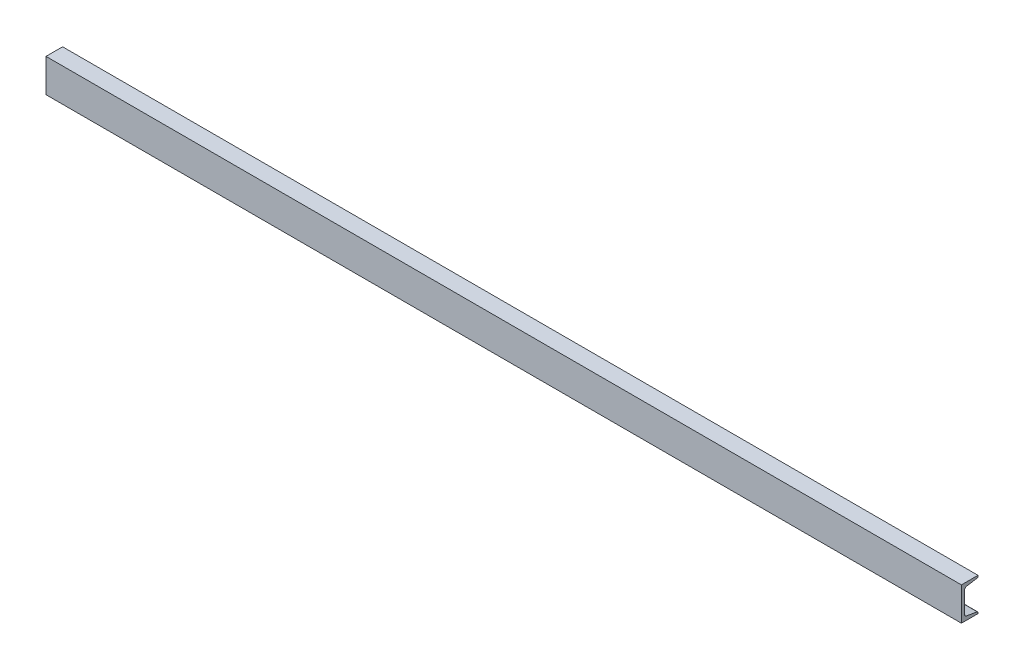
ISO-10303-21;
HEADER;
FILE_DESCRIPTION(('STEP AP214'),'2;1');
FILE_NAME('part.step','',(''),(''),'','','');
FILE_SCHEMA(('AUTOMOTIVE_DESIGN { 1 0 10303 214 1 1 1 1 }'));
ENDSEC;
DATA;
#1=APPLICATION_CONTEXT('core data for automotive mechanical design processes');
#2=APPLICATION_PROTOCOL_DEFINITION('international standard','automotive_design',2000,#1);
#3=PRODUCT_CONTEXT('',#1,'mechanical');
#4=PRODUCT('Part','Part','',(#3));
#5=PRODUCT_RELATED_PRODUCT_CATEGORY('part','',(#4));
#6=PRODUCT_DEFINITION_FORMATION('','',#4);
#7=PRODUCT_DEFINITION_CONTEXT('part definition',#1,'design');
#8=PRODUCT_DEFINITION('design','',#6,#7);
#9=PRODUCT_DEFINITION_SHAPE('','',#8);
#10=(LENGTH_UNIT() NAMED_UNIT(*) SI_UNIT(.MILLI.,.METRE.));
#11=(NAMED_UNIT(*) PLANE_ANGLE_UNIT() SI_UNIT($,.RADIAN.));
#12=(NAMED_UNIT(*) SI_UNIT($,.STERADIAN.) SOLID_ANGLE_UNIT());
#13=UNCERTAINTY_MEASURE_WITH_UNIT(LENGTH_MEASURE(1.E-05),#10,'distance_accuracy_value','');
#14=(GEOMETRIC_REPRESENTATION_CONTEXT(3) GLOBAL_UNCERTAINTY_ASSIGNED_CONTEXT((#13)) GLOBAL_UNIT_ASSIGNED_CONTEXT((#10,
#11,#12)) REPRESENTATION_CONTEXT('',''));
#15=CARTESIAN_POINT('',(0.,0.,0.));
#16=DIRECTION('',(0.,0.,1.));
#17=DIRECTION('',(1.,0.,0.));
#18=AXIS2_PLACEMENT_3D('',#15,#16,#17);
#19=CARTESIAN_POINT('',(2100.,-38.1,0.));
#20=DIRECTION('',(0.,1.,0.));
#21=DIRECTION('',(0.,0.,1.));
#22=AXIS2_PLACEMENT_3D('',#19,#20,#21);
#23=PLANE('',#22);
#24=DIRECTION('',(0.,0.,-1.));
#25=VECTOR('',#24,1.);
#26=CARTESIAN_POINT('',(0.,-38.1,0.));
#27=LINE('',#26,#25);
#28=CARTESIAN_POINT('',(0.,-38.1,0.));
#29=VERTEX_POINT('',#28);
#30=CARTESIAN_POINT('',(0.,-38.1,-38.0492));
#31=VERTEX_POINT('',#30);
#32=EDGE_CURVE('E195',#29,#31,#27,.T.);
#33=ORIENTED_EDGE('',*,*,#32,.T.);
#34=DIRECTION('',(-1.,0.,0.));
#35=VECTOR('',#34,1.);
#36=CARTESIAN_POINT('',(2100.,-38.1,-38.0492));
#37=LINE('',#36,#35);
#38=CARTESIAN_POINT('',(2100.,-38.1,-38.0492));
#39=VERTEX_POINT('',#38);
#40=EDGE_CURVE('E13',#39,#31,#37,.T.);
#41=ORIENTED_EDGE('',*,*,#40,.F.);
#42=DIRECTION('',(0.,0.,-1.));
#43=VECTOR('',#42,1.);
#44=CARTESIAN_POINT('',(2100.,-38.1,0.));
#45=LINE('',#44,#43);
#46=CARTESIAN_POINT('',(2100.,-38.1,0.));
#47=VERTEX_POINT('',#46);
#48=EDGE_CURVE('E217',#47,#39,#45,.T.);
#49=ORIENTED_EDGE('',*,*,#48,.F.);
#50=DIRECTION('',(-1.,0.,0.));
#51=VECTOR('',#50,1.);
#52=CARTESIAN_POINT('',(2100.,-38.1,0.));
#53=LINE('',#52,#51);
#54=EDGE_CURVE('E191',#47,#29,#53,.T.);
#55=ORIENTED_EDGE('',*,*,#54,.T.);
#56=EDGE_LOOP('',(#33,#41,#49,#55));
#57=FACE_BOUND('',#56,.T.);
#58=ADVANCED_FACE('F75',(#57),#23,.F.);
#59=CARTESIAN_POINT('',(2100.,-38.1,-38.0492));
#60=DIRECTION('',(0.,0.,1.));
#61=DIRECTION('',(1.,0.,0.));
#62=AXIS2_PLACEMENT_3D('',#59,#60,#61);
#63=PLANE('',#62);
#64=DIRECTION('',(0.,1.,0.));
#65=VECTOR('',#64,1.);
#66=CARTESIAN_POINT('',(0.,-38.1,-38.0492));
#67=LINE('',#66,#65);
#68=CARTESIAN_POINT('',(0.,-35.942335135838,-38.0492));
#69=VERTEX_POINT('',#68);
#70=EDGE_CURVE('E198',#31,#69,#67,.T.);
#71=ORIENTED_EDGE('',*,*,#70,.T.);
#72=DIRECTION('',(-1.,0.,0.));
#73=VECTOR('',#72,1.);
#74=CARTESIAN_POINT('',(2100.,-35.942335135838,-38.0492));
#75=LINE('',#74,#73);
#76=CARTESIAN_POINT('',(2100.,-35.942335135838,-38.0492));
#77=VERTEX_POINT('',#76);
#78=EDGE_CURVE('E83',#77,#69,#75,.T.);
#79=ORIENTED_EDGE('',*,*,#78,.F.);
#80=DIRECTION('',(0.,1.,0.));
#81=VECTOR('',#80,1.);
#82=CARTESIAN_POINT('',(2100.,-38.1,-38.0492));
#83=LINE('',#82,#81);
#84=EDGE_CURVE('E146',#39,#77,#83,.T.);
#85=ORIENTED_EDGE('',*,*,#84,.F.);
#86=ORIENTED_EDGE('',*,*,#40,.T.);
#87=EDGE_LOOP('',(#71,#79,#85,#86));
#88=FACE_BOUND('',#87,.T.);
#89=ADVANCED_FACE('F295',(#88),#63,.F.);
#90=CARTESIAN_POINT('',(2100.,-35.942335135838,-35.5092));
#91=DIRECTION('',(-1.,0.,0.));
#92=DIRECTION('',(0.,0.,1.));
#93=AXIS2_PLACEMENT_3D('',#90,#91,#92);
#94=CYLINDRICAL_SURFACE('',#93,2.54);
#95=CARTESIAN_POINT('',(0.,-35.942335135838,-35.5092));
#96=DIRECTION('',(1.,0.,0.));
#97=DIRECTION('',(0.,0.,-1.));
#98=AXIS2_PLACEMENT_3D('',#95,#96,#97);
#99=CIRCLE('',#98,2.54);
#100=CARTESIAN_POINT('',(0.,-33.4368995092487,-35.9268030663407));
#101=VERTEX_POINT('',#100);
#102=EDGE_CURVE('E200',#69,#101,#99,.T.);
#103=ORIENTED_EDGE('',*,*,#102,.T.);
#104=DIRECTION('',(-1.,0.,0.));
#105=VECTOR('',#104,1.);
#106=CARTESIAN_POINT('',(2100.,-33.4368995092487,-35.9268030663407));
#107=LINE('',#106,#105);
#108=CARTESIAN_POINT('',(2100.,-33.4368995092487,-35.9268030663407));
#109=VERTEX_POINT('',#108);
#110=EDGE_CURVE('E236',#109,#101,#107,.T.);
#111=ORIENTED_EDGE('',*,*,#110,.F.);
#112=CARTESIAN_POINT('',(2100.,-35.942335135838,-35.5092));
#113=DIRECTION('',(1.,0.,0.));
#114=DIRECTION('',(0.,0.,-1.));
#115=AXIS2_PLACEMENT_3D('',#112,#113,#114);
#116=CIRCLE('',#115,2.54);
#117=EDGE_CURVE('E244',#77,#109,#116,.T.);
#118=ORIENTED_EDGE('',*,*,#117,.F.);
#119=ORIENTED_EDGE('',*,*,#78,.T.);
#120=EDGE_LOOP('',(#103,#111,#118,#119));
#121=FACE_BOUND('',#120,.T.);
#122=ADVANCED_FACE('F242',(#121),#94,.T.);
#123=CARTESIAN_POINT('',(2100.,-29.4960901573836,-12.2836717208802));
#124=DIRECTION('',(0.,-0.986391978972162,0.164410656039629));
#125=DIRECTION('',(0.,-0.164410656039629,-0.986391978972162));
#126=AXIS2_PLACEMENT_3D('',#123,#124,#125);
#127=PLANE('',#126);
#128=DIRECTION('',(0.,0.164410656039629,0.986391978972162));
#129=VECTOR('',#128,1.);
#130=CARTESIAN_POINT('',(0.,-29.4960901573836,-12.2836717208802));
#131=LINE('',#130,#129);
#132=CARTESIAN_POINT('',(0.,-29.4960901573836,-12.2836717208802));
#133=VERTEX_POINT('',#132);
#134=EDGE_CURVE('E202',#101,#133,#131,.T.);
#135=ORIENTED_EDGE('',*,*,#134,.T.);
#136=DIRECTION('',(-1.,0.,0.));
#137=VECTOR('',#136,1.);
#138=CARTESIAN_POINT('',(2100.,-29.4960901573836,-12.2836717208802));
#139=LINE('',#138,#137);
#140=CARTESIAN_POINT('',(2100.,-29.4960901573836,-12.2836717208802));
#141=VERTEX_POINT('',#140);
#142=EDGE_CURVE('E233',#141,#133,#139,.T.);
#143=ORIENTED_EDGE('',*,*,#142,.F.);
#144=DIRECTION('',(0.,0.164410656039629,0.986391978972162));
#145=VECTOR('',#144,1.);
#146=CARTESIAN_POINT('',(2100.,-29.4960901573836,-12.2836717208802));
#147=LINE('',#146,#145);
#148=EDGE_CURVE('E262',#109,#141,#147,.T.);
#149=ORIENTED_EDGE('',*,*,#148,.F.);
#150=ORIENTED_EDGE('',*,*,#110,.T.);
#151=EDGE_LOOP('',(#135,#143,#149,#150));
#152=FACE_BOUND('',#151,.T.);
#153=ADVANCED_FACE('F253',(#152),#127,.F.);
#154=CARTESIAN_POINT('',(2100.,-22.7314139655925,-13.4112));
#155=DIRECTION('',(-1.,0.,0.));
#156=DIRECTION('',(0.,0.,1.));
#157=AXIS2_PLACEMENT_3D('',#154,#155,#156);
#158=CYLINDRICAL_SURFACE('',#157,6.85800000000001);
#159=CARTESIAN_POINT('',(0.,-22.7314139655925,-13.4112));
#160=DIRECTION('',(-1.,0.,0.));
#161=DIRECTION('',(0.,0.,-1.));
#162=AXIS2_PLACEMENT_3D('',#159,#160,#161);
#163=CIRCLE('',#162,6.85800000000001);
#164=CARTESIAN_POINT('',(0.,-22.7314139655925,-6.55320000000001));
#165=VERTEX_POINT('',#164);
#166=EDGE_CURVE('E204',#133,#165,#163,.T.);
#167=ORIENTED_EDGE('',*,*,#166,.T.);
#168=DIRECTION('',(-1.,0.,0.));
#169=VECTOR('',#168,1.);
#170=CARTESIAN_POINT('',(2100.,-22.7314139655925,-6.55320000000001));
#171=LINE('',#170,#169);
#172=CARTESIAN_POINT('',(2100.,-22.7314139655925,-6.55320000000001));
#173=VERTEX_POINT('',#172);
#174=EDGE_CURVE('E230',#173,#165,#171,.T.);
#175=ORIENTED_EDGE('',*,*,#174,.F.);
#176=CARTESIAN_POINT('',(2100.,-22.7314139655925,-13.4112));
#177=DIRECTION('',(-1.,0.,0.));
#178=DIRECTION('',(0.,0.,-1.));
#179=AXIS2_PLACEMENT_3D('',#176,#177,#178);
#180=CIRCLE('',#179,6.85800000000001);
#181=EDGE_CURVE('E259',#141,#173,#180,.T.);
#182=ORIENTED_EDGE('',*,*,#181,.F.);
#183=ORIENTED_EDGE('',*,*,#142,.T.);
#184=EDGE_LOOP('',(#167,#175,#182,#183));
#185=FACE_BOUND('',#184,.T.);
#186=ADVANCED_FACE('F257',(#185),#158,.F.);
#187=CARTESIAN_POINT('',(2100.,22.7314139655925,-6.55320000000001));
#188=DIRECTION('',(0.,0.,1.));
#189=DIRECTION('',(1.,0.,0.));
#190=AXIS2_PLACEMENT_3D('',#187,#188,#189);
#191=PLANE('',#190);
#192=DIRECTION('',(0.,1.,0.));
#193=VECTOR('',#192,1.);
#194=CARTESIAN_POINT('',(0.,22.7314139655925,-6.55320000000001));
#195=LINE('',#194,#193);
#196=CARTESIAN_POINT('',(0.,22.7314139655925,-6.5532));
#197=VERTEX_POINT('',#196);
#198=EDGE_CURVE('E206',#165,#197,#195,.T.);
#199=ORIENTED_EDGE('',*,*,#198,.T.);
#200=DIRECTION('',(-1.,0.,0.));
#201=VECTOR('',#200,1.);
#202=CARTESIAN_POINT('',(2100.,22.7314139655925,-6.5532));
#203=LINE('',#202,#201);
#204=CARTESIAN_POINT('',(2100.,22.7314139655925,-6.5532));
#205=VERTEX_POINT('',#204);
#206=EDGE_CURVE('E227',#205,#197,#203,.T.);
#207=ORIENTED_EDGE('',*,*,#206,.F.);
#208=DIRECTION('',(0.,1.,0.));
#209=VECTOR('',#208,1.);
#210=CARTESIAN_POINT('',(2100.,22.7314139655925,-6.55320000000001));
#211=LINE('',#210,#209);
#212=EDGE_CURVE('E261',#173,#205,#211,.T.);
#213=ORIENTED_EDGE('',*,*,#212,.F.);
#214=ORIENTED_EDGE('',*,*,#174,.T.);
#215=EDGE_LOOP('',(#199,#207,#213,#214));
#216=FACE_BOUND('',#215,.T.);
#217=ADVANCED_FACE('F308',(#216),#191,.F.);
#218=CARTESIAN_POINT('',(2100.,22.7314139655925,-13.4112));
#219=DIRECTION('',(-1.,0.,0.));
#220=DIRECTION('',(0.,0.,1.));
#221=AXIS2_PLACEMENT_3D('',#218,#219,#220);
#222=CYLINDRICAL_SURFACE('',#221,6.85800000000001);
#223=CARTESIAN_POINT('',(0.,22.7314139655925,-13.4112));
#224=DIRECTION('',(-1.,0.,0.));
#225=DIRECTION('',(0.,0.,1.));
#226=AXIS2_PLACEMENT_3D('',#223,#224,#225);
#227=CIRCLE('',#226,6.85800000000001);
#228=CARTESIAN_POINT('',(0.,29.4960901573836,-12.2836717208802));
#229=VERTEX_POINT('',#228);
#230=EDGE_CURVE('E208',#197,#229,#227,.T.);
#231=ORIENTED_EDGE('',*,*,#230,.T.);
#232=DIRECTION('',(-1.,0.,0.));
#233=VECTOR('',#232,1.);
#234=CARTESIAN_POINT('',(2100.,29.4960901573836,-12.2836717208802));
#235=LINE('',#234,#233);
#236=CARTESIAN_POINT('',(2100.,29.4960901573836,-12.2836717208802));
#237=VERTEX_POINT('',#236);
#238=EDGE_CURVE('E224',#237,#229,#235,.T.);
#239=ORIENTED_EDGE('',*,*,#238,.F.);
#240=CARTESIAN_POINT('',(2100.,22.7314139655925,-13.4112));
#241=DIRECTION('',(-1.,0.,0.));
#242=DIRECTION('',(0.,0.,1.));
#243=AXIS2_PLACEMENT_3D('',#240,#241,#242);
#244=CIRCLE('',#243,6.85800000000001);
#245=EDGE_CURVE('E264',#205,#237,#244,.T.);
#246=ORIENTED_EDGE('',*,*,#245,.F.);
#247=ORIENTED_EDGE('',*,*,#206,.T.);
#248=EDGE_LOOP('',(#231,#239,#246,#247));
#249=FACE_BOUND('',#248,.T.);
#250=ADVANCED_FACE('F311',(#249),#222,.F.);
#251=CARTESIAN_POINT('',(2100.,29.4960901573836,-12.2836717208802));
#252=DIRECTION('',(0.,0.986391978972162,0.164410656039629));
#253=DIRECTION('',(0.,-0.164410656039629,0.986391978972162));
#254=AXIS2_PLACEMENT_3D('',#251,#252,#253);
#255=PLANE('',#254);
#256=DIRECTION('',(0.,0.164410656039629,-0.986391978972162));
#257=VECTOR('',#256,1.);
#258=CARTESIAN_POINT('',(0.,29.4960901573836,-12.2836717208802));
#259=LINE('',#258,#257);
#260=CARTESIAN_POINT('',(0.,33.4368995092487,-35.9268030663407));
#261=VERTEX_POINT('',#260);
#262=EDGE_CURVE('E210',#229,#261,#259,.T.);
#263=ORIENTED_EDGE('',*,*,#262,.T.);
#264=DIRECTION('',(-1.,0.,0.));
#265=VECTOR('',#264,1.);
#266=CARTESIAN_POINT('',(2100.,33.4368995092487,-35.9268030663407));
#267=LINE('',#266,#265);
#268=CARTESIAN_POINT('',(2100.,33.4368995092487,-35.9268030663407));
#269=VERTEX_POINT('',#268);
#270=EDGE_CURVE('E221',#269,#261,#267,.T.);
#271=ORIENTED_EDGE('',*,*,#270,.F.);
#272=DIRECTION('',(0.,0.164410656039629,-0.986391978972162));
#273=VECTOR('',#272,1.);
#274=CARTESIAN_POINT('',(2100.,29.4960901573836,-12.2836717208802));
#275=LINE('',#274,#273);
#276=EDGE_CURVE('E270',#237,#269,#275,.T.);
#277=ORIENTED_EDGE('',*,*,#276,.F.);
#278=ORIENTED_EDGE('',*,*,#238,.T.);
#279=EDGE_LOOP('',(#263,#271,#277,#278));
#280=FACE_BOUND('',#279,.T.);
#281=ADVANCED_FACE('F276',(#280),#255,.F.);
#282=CARTESIAN_POINT('',(2100.,35.942335135838,-35.5092));
#283=DIRECTION('',(-1.,0.,0.));
#284=DIRECTION('',(0.,0.,1.));
#285=AXIS2_PLACEMENT_3D('',#282,#283,#284);
#286=CYLINDRICAL_SURFACE('',#285,2.54);
#287=CARTESIAN_POINT('',(0.,35.942335135838,-35.5092));
#288=DIRECTION('',(1.,0.,0.));
#289=DIRECTION('',(0.,0.,1.));
#290=AXIS2_PLACEMENT_3D('',#287,#288,#289);
#291=CIRCLE('',#290,2.54);
#292=CARTESIAN_POINT('',(0.,35.942335135838,-38.0492));
#293=VERTEX_POINT('',#292);
#294=EDGE_CURVE('E212',#261,#293,#291,.T.);
#295=ORIENTED_EDGE('',*,*,#294,.T.);
#296=DIRECTION('',(-1.,0.,0.));
#297=VECTOR('',#296,1.);
#298=CARTESIAN_POINT('',(2100.,35.942335135838,-38.0492));
#299=LINE('',#298,#297);
#300=CARTESIAN_POINT('',(2100.,35.942335135838,-38.0492));
#301=VERTEX_POINT('',#300);
#302=EDGE_CURVE('E186',#301,#293,#299,.T.);
#303=ORIENTED_EDGE('',*,*,#302,.F.);
#304=CARTESIAN_POINT('',(2100.,35.942335135838,-35.5092));
#305=DIRECTION('',(1.,0.,0.));
#306=DIRECTION('',(0.,0.,1.));
#307=AXIS2_PLACEMENT_3D('',#304,#305,#306);
#308=CIRCLE('',#307,2.54);
#309=EDGE_CURVE('E177',#269,#301,#308,.T.);
#310=ORIENTED_EDGE('',*,*,#309,.F.);
#311=ORIENTED_EDGE('',*,*,#270,.T.);
#312=EDGE_LOOP('',(#295,#303,#310,#311));
#313=FACE_BOUND('',#312,.T.);
#314=ADVANCED_FACE('F280',(#313),#286,.T.);
#315=CARTESIAN_POINT('',(2100.,38.1,-38.0492));
#316=DIRECTION('',(0.,0.,1.));
#317=DIRECTION('',(1.,0.,0.));
#318=AXIS2_PLACEMENT_3D('',#315,#316,#317);
#319=PLANE('',#318);
#320=DIRECTION('',(0.,1.,0.));
#321=VECTOR('',#320,1.);
#322=CARTESIAN_POINT('',(0.,38.1,-38.0492));
#323=LINE('',#322,#321);
#324=CARTESIAN_POINT('',(0.,38.1,-38.0492));
#325=VERTEX_POINT('',#324);
#326=EDGE_CURVE('E185',#293,#325,#323,.T.);
#327=ORIENTED_EDGE('',*,*,#326,.T.);
#328=DIRECTION('',(-1.,0.,0.));
#329=VECTOR('',#328,1.);
#330=CARTESIAN_POINT('',(2100.,38.1,-38.0492));
#331=LINE('',#330,#329);
#332=CARTESIAN_POINT('',(2100.,38.1,-38.0492));
#333=VERTEX_POINT('',#332);
#334=EDGE_CURVE('E182',#333,#325,#331,.T.);
#335=ORIENTED_EDGE('',*,*,#334,.F.);
#336=DIRECTION('',(0.,1.,0.));
#337=VECTOR('',#336,1.);
#338=CARTESIAN_POINT('',(2100.,38.1,-38.0492));
#339=LINE('',#338,#337);
#340=EDGE_CURVE('E171',#301,#333,#339,.T.);
#341=ORIENTED_EDGE('',*,*,#340,.F.);
#342=ORIENTED_EDGE('',*,*,#302,.T.);
#343=EDGE_LOOP('',(#327,#335,#341,#342));
#344=FACE_BOUND('',#343,.T.);
#345=ADVANCED_FACE('F183',(#344),#319,.F.);
#346=CARTESIAN_POINT('',(2100.,38.1,0.));
#347=DIRECTION('',(0.,-1.,0.));
#348=DIRECTION('',(0.,0.,-1.));
#349=AXIS2_PLACEMENT_3D('',#346,#347,#348);
#350=PLANE('',#349);
#351=DIRECTION('',(0.,0.,1.));
#352=VECTOR('',#351,1.);
#353=CARTESIAN_POINT('',(0.,38.1,0.));
#354=LINE('',#353,#352);
#355=CARTESIAN_POINT('',(0.,38.1,0.));
#356=VERTEX_POINT('',#355);
#357=EDGE_CURVE('E132',#325,#356,#354,.T.);
#358=ORIENTED_EDGE('',*,*,#357,.T.);
#359=DIRECTION('',(-1.,0.,0.));
#360=VECTOR('',#359,1.);
#361=CARTESIAN_POINT('',(2100.,38.1,0.));
#362=LINE('',#361,#360);
#363=CARTESIAN_POINT('',(2100.,38.1,0.));
#364=VERTEX_POINT('',#363);
#365=EDGE_CURVE('E187',#364,#356,#362,.T.);
#366=ORIENTED_EDGE('',*,*,#365,.F.);
#367=DIRECTION('',(0.,0.,1.));
#368=VECTOR('',#367,1.);
#369=CARTESIAN_POINT('',(2100.,38.1,0.));
#370=LINE('',#369,#368);
#371=EDGE_CURVE('E175',#333,#364,#370,.T.);
#372=ORIENTED_EDGE('',*,*,#371,.F.);
#373=ORIENTED_EDGE('',*,*,#334,.T.);
#374=EDGE_LOOP('',(#358,#366,#372,#373));
#375=FACE_BOUND('',#374,.T.);
#376=ADVANCED_FACE('F189',(#375),#350,.F.);
#377=CARTESIAN_POINT('',(2100.,-38.1,0.));
#378=DIRECTION('',(0.,0.,-1.));
#379=DIRECTION('',(-1.,0.,0.));
#380=AXIS2_PLACEMENT_3D('',#377,#378,#379);
#381=PLANE('',#380);
#382=DIRECTION('',(0.,-1.,0.));
#383=VECTOR('',#382,1.);
#384=CARTESIAN_POINT('',(0.,-38.1,0.));
#385=LINE('',#384,#383);
#386=EDGE_CURVE('E138',#356,#29,#385,.T.);
#387=ORIENTED_EDGE('',*,*,#386,.T.);
#388=ORIENTED_EDGE('',*,*,#54,.F.);
#389=DIRECTION('',(0.,-1.,0.));
#390=VECTOR('',#389,1.);
#391=CARTESIAN_POINT('',(2100.,-38.1,0.));
#392=LINE('',#391,#390);
#393=EDGE_CURVE('E91',#364,#47,#392,.T.);
#394=ORIENTED_EDGE('',*,*,#393,.F.);
#395=ORIENTED_EDGE('',*,*,#365,.T.);
#396=EDGE_LOOP('',(#387,#388,#394,#395));
#397=FACE_BOUND('',#396,.T.);
#398=ADVANCED_FACE('F284',(#397),#381,.F.);
#399=CARTESIAN_POINT('',(2100.,-35.942335135838,-35.5092));
#400=DIRECTION('',(1.,0.,0.));
#401=DIRECTION('',(0.,0.,-1.));
#402=AXIS2_PLACEMENT_3D('',#399,#400,#401);
#403=PLANE('',#402);
#404=ORIENTED_EDGE('',*,*,#48,.T.);
#405=ORIENTED_EDGE('',*,*,#84,.T.);
#406=ORIENTED_EDGE('',*,*,#117,.T.);
#407=ORIENTED_EDGE('',*,*,#148,.T.);
#408=ORIENTED_EDGE('',*,*,#181,.T.);
#409=ORIENTED_EDGE('',*,*,#212,.T.);
#410=ORIENTED_EDGE('',*,*,#245,.T.);
#411=ORIENTED_EDGE('',*,*,#276,.T.);
#412=ORIENTED_EDGE('',*,*,#309,.T.);
#413=ORIENTED_EDGE('',*,*,#340,.T.);
#414=ORIENTED_EDGE('',*,*,#371,.T.);
#415=ORIENTED_EDGE('',*,*,#393,.T.);
#416=EDGE_LOOP('',(#404,#405,#406,#407,#408,#409,#410,#411,#412,#413,#414,#415));
#417=FACE_BOUND('',#416,.T.);
#418=ADVANCED_FACE('F173',(#417),#403,.T.);
#419=CARTESIAN_POINT('',(0.,-35.942335135838,-35.5092));
#420=DIRECTION('',(1.,0.,0.));
#421=DIRECTION('',(0.,0.,-1.));
#422=AXIS2_PLACEMENT_3D('',#419,#420,#421);
#423=PLANE('',#422);
#424=ORIENTED_EDGE('',*,*,#32,.F.);
#425=ORIENTED_EDGE('',*,*,#386,.F.);
#426=ORIENTED_EDGE('',*,*,#357,.F.);
#427=ORIENTED_EDGE('',*,*,#326,.F.);
#428=ORIENTED_EDGE('',*,*,#294,.F.);
#429=ORIENTED_EDGE('',*,*,#262,.F.);
#430=ORIENTED_EDGE('',*,*,#230,.F.);
#431=ORIENTED_EDGE('',*,*,#198,.F.);
#432=ORIENTED_EDGE('',*,*,#166,.F.);
#433=ORIENTED_EDGE('',*,*,#134,.F.);
#434=ORIENTED_EDGE('',*,*,#102,.F.);
#435=ORIENTED_EDGE('',*,*,#70,.F.);
#436=EDGE_LOOP('',(#424,#425,#426,#427,#428,#429,#430,#431,#432,#433,#434,#435));
#437=FACE_BOUND('',#436,.T.);
#438=ADVANCED_FACE('F248',(#437),#423,.F.);
#439=CLOSED_SHELL('',(#58,#89,#122,#153,#186,#217,#250,#281,#314,#345,#376,#398,#418,#438));
#440=MANIFOLD_SOLID_BREP('B2',#439);
#441=ADVANCED_BREP_SHAPE_REPRESENTATION('',(#18,#440),#14);
#442=SHAPE_DEFINITION_REPRESENTATION(#9,#441);
ENDSEC;
END-ISO-10303-21;
